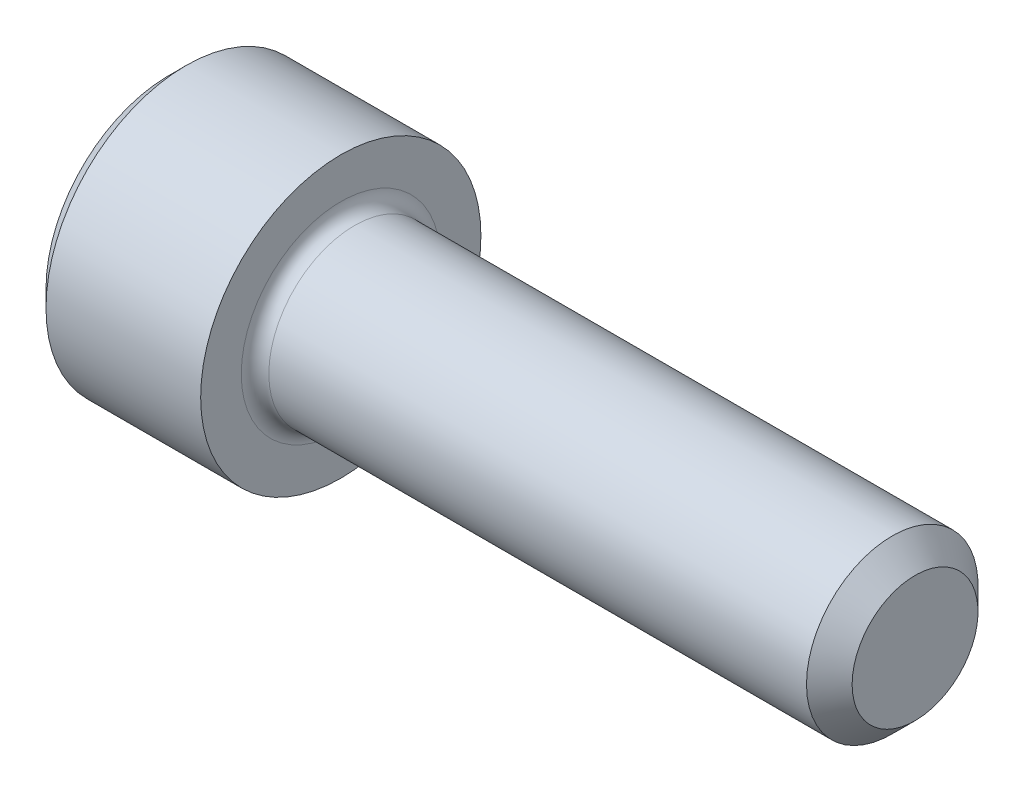
ISO-10303-21;
HEADER;
FILE_DESCRIPTION(('STEP AP214'),'2;1');
FILE_NAME('part.step','',(''),(''),'','','');
FILE_SCHEMA(('AUTOMOTIVE_DESIGN { 1 0 10303 214 1 1 1 1 }'));
ENDSEC;
DATA;
#1=APPLICATION_CONTEXT('core data for automotive mechanical design processes');
#2=APPLICATION_PROTOCOL_DEFINITION('international standard','automotive_design',2000,#1);
#3=PRODUCT_CONTEXT('',#1,'mechanical');
#4=PRODUCT('Part','Part','',(#3));
#5=PRODUCT_RELATED_PRODUCT_CATEGORY('part','',(#4));
#6=PRODUCT_DEFINITION_FORMATION('','',#4);
#7=PRODUCT_DEFINITION_CONTEXT('part definition',#1,'design');
#8=PRODUCT_DEFINITION('design','',#6,#7);
#9=PRODUCT_DEFINITION_SHAPE('','',#8);
#10=(LENGTH_UNIT() NAMED_UNIT(*) SI_UNIT(.MILLI.,.METRE.));
#11=(NAMED_UNIT(*) PLANE_ANGLE_UNIT() SI_UNIT($,.RADIAN.));
#12=(NAMED_UNIT(*) SI_UNIT($,.STERADIAN.) SOLID_ANGLE_UNIT());
#13=UNCERTAINTY_MEASURE_WITH_UNIT(LENGTH_MEASURE(1.E-05),#10,'distance_accuracy_value','');
#14=(GEOMETRIC_REPRESENTATION_CONTEXT(3) GLOBAL_UNCERTAINTY_ASSIGNED_CONTEXT((#13)) GLOBAL_UNIT_ASSIGNED_CONTEXT((#10,
#11,#12)) REPRESENTATION_CONTEXT('',''));
#15=CARTESIAN_POINT('',(0.,0.,0.));
#16=DIRECTION('',(0.,0.,1.));
#17=DIRECTION('',(1.,0.,0.));
#18=AXIS2_PLACEMENT_3D('',#15,#16,#17);
#19=CARTESIAN_POINT('',(0.,0.,0.));
#20=DIRECTION('',(-1.,0.,0.));
#21=DIRECTION('',(0.,0.,1.));
#22=AXIS2_PLACEMENT_3D('',#19,#20,#21);
#23=PLANE('',#22);
#24=DIRECTION('',(0.,-0.499999999999999,0.866025403784439));
#25=VECTOR('',#24,1.);
#26=CARTESIAN_POINT('',(0.,1.37848150271716,0.));
#27=LINE('',#26,#25);
#28=CARTESIAN_POINT('',(0.,1.37848150271716,0.));
#29=VERTEX_POINT('',#28);
#30=CARTESIAN_POINT('',(0.,0.689240751358582,1.1938));
#31=VERTEX_POINT('',#30);
#32=EDGE_CURVE('E117',#29,#31,#27,.T.);
#33=ORIENTED_EDGE('',*,*,#32,.T.);
#34=DIRECTION('',(0.,1.,0.));
#35=VECTOR('',#34,1.);
#36=CARTESIAN_POINT('',(0.,-0.689240751358569,1.1938));
#37=LINE('',#36,#35);
#38=CARTESIAN_POINT('',(0.,-0.689240751358569,1.1938));
#39=VERTEX_POINT('',#38);
#40=EDGE_CURVE('E106',#39,#31,#37,.T.);
#41=ORIENTED_EDGE('',*,*,#40,.F.);
#42=DIRECTION('',(0.,-0.500000000000001,-0.866025403784438));
#43=VECTOR('',#42,1.);
#44=CARTESIAN_POINT('',(0.,-0.689240751358569,1.1938));
#45=LINE('',#44,#43);
#46=CARTESIAN_POINT('',(0.,-1.37848150271715,0.));
#47=VERTEX_POINT('',#46);
#48=EDGE_CURVE('E116',#39,#47,#45,.T.);
#49=ORIENTED_EDGE('',*,*,#48,.T.);
#50=DIRECTION('',(0.,0.499999999999999,-0.866025403784439));
#51=VECTOR('',#50,1.);
#52=CARTESIAN_POINT('',(0.,-1.37848150271715,0.));
#53=LINE('',#52,#51);
#54=CARTESIAN_POINT('',(0.,-0.689240751358572,-1.1938));
#55=VERTEX_POINT('',#54);
#56=EDGE_CURVE('E131',#47,#55,#53,.T.);
#57=ORIENTED_EDGE('',*,*,#56,.T.);
#58=DIRECTION('',(0.,-1.,0.));
#59=VECTOR('',#58,1.);
#60=CARTESIAN_POINT('',(0.,0.689240751358578,-1.1938));
#61=LINE('',#60,#59);
#62=CARTESIAN_POINT('',(0.,0.689240751358578,-1.1938));
#63=VERTEX_POINT('',#62);
#64=EDGE_CURVE('E134',#63,#55,#61,.T.);
#65=ORIENTED_EDGE('',*,*,#64,.F.);
#66=DIRECTION('',(0.,-0.500000000000001,-0.866025403784438));
#67=VECTOR('',#66,1.);
#68=CARTESIAN_POINT('',(0.,1.37848150271716,0.));
#69=LINE('',#68,#67);
#70=EDGE_CURVE('E126',#29,#63,#69,.T.);
#71=ORIENTED_EDGE('',*,*,#70,.F.);
#72=EDGE_LOOP('',(#33,#41,#49,#57,#65,#71));
#73=FACE_BOUND('',#72,.T.);
#74=CARTESIAN_POINT('',(0.,0.,0.));
#75=DIRECTION('',(-1.,0.,0.));
#76=DIRECTION('',(0.,0.,1.));
#77=AXIS2_PLACEMENT_3D('',#74,#75,#76);
#78=CIRCLE('',#77,2.04469999999999);
#79=CARTESIAN_POINT('',(0.,0.,2.04469999999999));
#80=VERTEX_POINT('',#79);
#81=EDGE_CURVE('E186',#80,#80,#78,.T.);
#82=ORIENTED_EDGE('',*,*,#81,.T.);
#83=EDGE_LOOP('',(#82));
#84=FACE_BOUND('',#83,.T.);
#85=ADVANCED_FACE('F34',(#73,#84),#23,.T.);
#86=CARTESIAN_POINT('',(0.,0.,0.));
#87=DIRECTION('',(1.,0.,0.));
#88=DIRECTION('',(0.,0.,-1.));
#89=AXIS2_PLACEMENT_3D('',#86,#87,#88);
#90=CONICAL_SURFACE('',#89,2.04469999999999,0.785398163397459);
#91=CARTESIAN_POINT('',(0.279400000000006,0.,0.));
#92=DIRECTION('',(-1.,0.,0.));
#93=DIRECTION('',(0.,0.,1.));
#94=AXIS2_PLACEMENT_3D('',#91,#92,#93);
#95=CIRCLE('',#94,2.3241);
#96=CARTESIAN_POINT('',(0.279400000000006,0.,2.3241));
#97=VERTEX_POINT('',#96);
#98=EDGE_CURVE('E183',#97,#97,#95,.T.);
#99=ORIENTED_EDGE('',*,*,#98,.T.);
#100=EDGE_LOOP('',(#99));
#101=FACE_BOUND('',#100,.T.);
#102=ORIENTED_EDGE('',*,*,#81,.F.);
#103=EDGE_LOOP('',(#102));
#104=FACE_BOUND('',#103,.T.);
#105=ADVANCED_FACE('F210',(#101,#104),#90,.T.);
#106=CARTESIAN_POINT('',(-31.75,0.,0.));
#107=DIRECTION('',(-1.,0.,0.));
#108=DIRECTION('',(0.,0.,1.));
#109=AXIS2_PLACEMENT_3D('',#106,#107,#108);
#110=CYLINDRICAL_SURFACE('',#109,2.3241);
#111=CARTESIAN_POINT('',(2.84480000000001,0.,0.));
#112=DIRECTION('',(-1.,0.,0.));
#113=DIRECTION('',(0.,0.,1.));
#114=AXIS2_PLACEMENT_3D('',#111,#112,#113);
#115=CIRCLE('',#114,2.3241);
#116=CARTESIAN_POINT('',(2.84480000000001,0.,2.3241));
#117=VERTEX_POINT('',#116);
#118=EDGE_CURVE('E180',#117,#117,#115,.T.);
#119=ORIENTED_EDGE('',*,*,#118,.T.);
#120=EDGE_LOOP('',(#119));
#121=FACE_BOUND('',#120,.T.);
#122=ORIENTED_EDGE('',*,*,#98,.F.);
#123=EDGE_LOOP('',(#122));
#124=FACE_BOUND('',#123,.T.);
#125=ADVANCED_FACE('F214',(#121,#124),#110,.T.);
#126=CARTESIAN_POINT('',(2.84480000000001,2.3241,0.));
#127=DIRECTION('',(1.,0.,0.));
#128=DIRECTION('',(0.,0.,-1.));
#129=AXIS2_PLACEMENT_3D('',#126,#127,#128);
#130=PLANE('',#129);
#131=CARTESIAN_POINT('',(2.84480000000001,0.,0.));
#132=DIRECTION('',(1.,0.,0.));
#133=DIRECTION('',(0.,0.,-1.));
#134=AXIS2_PLACEMENT_3D('',#131,#132,#133);
#135=CIRCLE('',#134,1.651);
#136=CARTESIAN_POINT('',(2.84480000000001,0.,-1.651));
#137=VERTEX_POINT('',#136);
#138=EDGE_CURVE('E41',#137,#137,#135,.F.);
#139=ORIENTED_EDGE('',*,*,#138,.T.);
#140=EDGE_LOOP('',(#139));
#141=FACE_BOUND('',#140,.T.);
#142=ORIENTED_EDGE('',*,*,#118,.F.);
#143=EDGE_LOOP('',(#142));
#144=FACE_BOUND('',#143,.T.);
#145=ADVANCED_FACE('F191',(#141,#144),#130,.T.);
#146=CARTESIAN_POINT('',(-31.75,0.,0.));
#147=DIRECTION('',(-1.,0.,0.));
#148=DIRECTION('',(0.,0.,1.));
#149=AXIS2_PLACEMENT_3D('',#146,#147,#148);
#150=CYLINDRICAL_SURFACE('',#149,1.4224);
#151=CARTESIAN_POINT('',(3.0734,0.,0.));
#152=DIRECTION('',(1.,0.,0.));
#153=DIRECTION('',(0.,0.,-1.));
#154=AXIS2_PLACEMENT_3D('',#151,#152,#153);
#155=CIRCLE('',#154,1.4224);
#156=CARTESIAN_POINT('',(3.0734,0.,-1.4224));
#157=VERTEX_POINT('',#156);
#158=EDGE_CURVE('E11',#157,#157,#155,.T.);
#159=ORIENTED_EDGE('',*,*,#158,.T.);
#160=EDGE_LOOP('',(#159));
#161=FACE_BOUND('',#160,.T.);
#162=CARTESIAN_POINT('',(11.99134,0.,0.));
#163=DIRECTION('',(-1.,0.,0.));
#164=DIRECTION('',(0.,0.,1.));
#165=AXIS2_PLACEMENT_3D('',#162,#163,#164);
#166=CIRCLE('',#165,1.4224);
#167=CARTESIAN_POINT('',(11.99134,0.,1.4224));
#168=VERTEX_POINT('',#167);
#169=EDGE_CURVE('E177',#168,#168,#166,.T.);
#170=ORIENTED_EDGE('',*,*,#169,.T.);
#171=EDGE_LOOP('',(#170));
#172=FACE_BOUND('',#171,.T.);
#173=ADVANCED_FACE('F225',(#161,#172),#150,.T.);
#174=CARTESIAN_POINT('',(12.3698,0.,0.));
#175=DIRECTION('',(-1.,0.,0.));
#176=DIRECTION('',(0.,0.,1.));
#177=AXIS2_PLACEMENT_3D('',#174,#175,#176);
#178=CONICAL_SURFACE('',#177,1.04394,0.785398163397447);
#179=ORIENTED_EDGE('',*,*,#169,.F.);
#180=EDGE_LOOP('',(#179));
#181=FACE_BOUND('',#180,.T.);
#182=CARTESIAN_POINT('',(12.3698,0.,0.));
#183=DIRECTION('',(-1.,0.,0.));
#184=DIRECTION('',(0.,0.,1.));
#185=AXIS2_PLACEMENT_3D('',#182,#183,#184);
#186=CIRCLE('',#185,1.04394);
#187=CARTESIAN_POINT('',(12.3698,0.,1.04394));
#188=VERTEX_POINT('',#187);
#189=EDGE_CURVE('E173',#188,#188,#186,.T.);
#190=ORIENTED_EDGE('',*,*,#189,.T.);
#191=EDGE_LOOP('',(#190));
#192=FACE_BOUND('',#191,.T.);
#193=ADVANCED_FACE('F204',(#181,#192),#178,.T.);
#194=CARTESIAN_POINT('',(12.3698,1.04394,0.));
#195=DIRECTION('',(1.,0.,0.));
#196=DIRECTION('',(0.,0.,-1.));
#197=AXIS2_PLACEMENT_3D('',#194,#195,#196);
#198=PLANE('',#197);
#199=ORIENTED_EDGE('',*,*,#189,.F.);
#200=EDGE_LOOP('',(#199));
#201=FACE_BOUND('',#200,.T.);
#202=ADVANCED_FACE('F196',(#201),#198,.T.);
#203=CARTESIAN_POINT('',(3.0734,0.,0.));
#204=DIRECTION('',(1.,0.,0.));
#205=DIRECTION('',(0.,0.,-1.));
#206=AXIS2_PLACEMENT_3D('',#203,#204,#205);
#207=TOROIDAL_SURFACE('',#206,1.651,0.2286);
#208=ORIENTED_EDGE('',*,*,#158,.F.);
#209=EDGE_LOOP('',(#208));
#210=FACE_BOUND('',#209,.T.);
#211=ORIENTED_EDGE('',*,*,#138,.F.);
#212=EDGE_LOOP('',(#211));
#213=FACE_BOUND('',#212,.T.);
#214=ADVANCED_FACE('F194',(#210,#213),#207,.F.);
#215=CARTESIAN_POINT('',(1.2954,1.37848150271716,0.));
#216=DIRECTION('',(0.,-0.866025403784439,-0.499999999999999));
#217=DIRECTION('',(0.,0.499999999999999,-0.866025403784439));
#218=AXIS2_PLACEMENT_3D('',#215,#216,#217);
#219=PLANE('',#218);
#220=ORIENTED_EDGE('',*,*,#32,.F.);
#221=DIRECTION('',(-1.,0.,0.));
#222=VECTOR('',#221,1.);
#223=CARTESIAN_POINT('',(1.2954,1.37848150271716,0.));
#224=LINE('',#223,#222);
#225=CARTESIAN_POINT('',(1.2954,1.37848150271716,0.));
#226=VERTEX_POINT('',#225);
#227=EDGE_CURVE('E158',#226,#29,#224,.T.);
#228=ORIENTED_EDGE('',*,*,#227,.F.);
#229=DIRECTION('',(0.,-0.499999999999999,0.866025403784439));
#230=VECTOR('',#229,1.);
#231=CARTESIAN_POINT('',(1.2954,1.37848150271716,0.));
#232=LINE('',#231,#230);
#233=CARTESIAN_POINT('',(1.29540000000001,1.03386112703786,0.596899999999998));
#234=VERTEX_POINT('',#233);
#235=EDGE_CURVE('E48',#226,#234,#232,.T.);
#236=ORIENTED_EDGE('',*,*,#235,.T.);
#237=CARTESIAN_POINT('',(1.2954,0.689240751358582,1.1938));
#238=VERTEX_POINT('',#237);
#239=EDGE_CURVE('E121',#234,#238,#232,.T.);
#240=ORIENTED_EDGE('',*,*,#239,.T.);
#241=DIRECTION('',(-1.,0.,0.));
#242=VECTOR('',#241,1.);
#243=CARTESIAN_POINT('',(1.2954,0.689240751358582,1.1938));
#244=LINE('',#243,#242);
#245=EDGE_CURVE('E110',#238,#31,#244,.T.);
#246=ORIENTED_EDGE('',*,*,#245,.T.);
#247=EDGE_LOOP('',(#220,#228,#236,#240,#246));
#248=FACE_BOUND('',#247,.T.);
#249=ADVANCED_FACE('F119',(#248),#219,.T.);
#250=CARTESIAN_POINT('',(1.2954,-0.689240751358569,1.1938));
#251=DIRECTION('',(0.,0.,1.));
#252=DIRECTION('',(0.,-1.,0.));
#253=AXIS2_PLACEMENT_3D('',#250,#251,#252);
#254=PLANE('',#253);
#255=ORIENTED_EDGE('',*,*,#40,.T.);
#256=ORIENTED_EDGE('',*,*,#245,.F.);
#257=DIRECTION('',(0.,1.,0.));
#258=VECTOR('',#257,1.);
#259=CARTESIAN_POINT('',(1.2954,-0.689240751358569,1.1938));
#260=LINE('',#259,#258);
#261=CARTESIAN_POINT('',(1.2954,0.,1.1938));
#262=VERTEX_POINT('',#261);
#263=EDGE_CURVE('E138',#262,#238,#260,.T.);
#264=ORIENTED_EDGE('',*,*,#263,.F.);
#265=CARTESIAN_POINT('',(1.2954,-0.689240751358569,1.1938));
#266=VERTEX_POINT('',#265);
#267=EDGE_CURVE('E139',#266,#262,#260,.T.);
#268=ORIENTED_EDGE('',*,*,#267,.F.);
#269=DIRECTION('',(-1.,0.,0.));
#270=VECTOR('',#269,1.);
#271=CARTESIAN_POINT('',(1.2954,-0.689240751358569,1.1938));
#272=LINE('',#271,#270);
#273=EDGE_CURVE('E112',#266,#39,#272,.T.);
#274=ORIENTED_EDGE('',*,*,#273,.T.);
#275=EDGE_LOOP('',(#255,#256,#264,#268,#274));
#276=FACE_BOUND('',#275,.T.);
#277=ADVANCED_FACE('F108',(#276),#254,.F.);
#278=CARTESIAN_POINT('',(1.2954,-0.689240751358569,1.1938));
#279=DIRECTION('',(0.,0.866025403784438,-0.500000000000001));
#280=DIRECTION('',(0.,0.500000000000001,0.866025403784438));
#281=AXIS2_PLACEMENT_3D('',#278,#279,#280);
#282=PLANE('',#281);
#283=ORIENTED_EDGE('',*,*,#48,.F.);
#284=ORIENTED_EDGE('',*,*,#273,.F.);
#285=DIRECTION('',(0.,-0.500000000000001,-0.866025403784438));
#286=VECTOR('',#285,1.);
#287=CARTESIAN_POINT('',(1.2954,-0.689240751358569,1.1938));
#288=LINE('',#287,#286);
#289=CARTESIAN_POINT('',(1.2954,-1.03386112703786,0.596899999999999));
#290=VERTEX_POINT('',#289);
#291=EDGE_CURVE('E143',#266,#290,#288,.T.);
#292=ORIENTED_EDGE('',*,*,#291,.T.);
#293=CARTESIAN_POINT('',(1.2954,-1.37848150271715,0.));
#294=VERTEX_POINT('',#293);
#295=EDGE_CURVE('E142',#290,#294,#288,.T.);
#296=ORIENTED_EDGE('',*,*,#295,.T.);
#297=DIRECTION('',(-1.,0.,0.));
#298=VECTOR('',#297,1.);
#299=CARTESIAN_POINT('',(1.2954,-1.37848150271715,0.));
#300=LINE('',#299,#298);
#301=EDGE_CURVE('E166',#294,#47,#300,.T.);
#302=ORIENTED_EDGE('',*,*,#301,.T.);
#303=EDGE_LOOP('',(#283,#284,#292,#296,#302));
#304=FACE_BOUND('',#303,.T.);
#305=ADVANCED_FACE('F281',(#304),#282,.T.);
#306=CARTESIAN_POINT('',(1.2954,-1.37848150271715,0.));
#307=DIRECTION('',(0.,0.866025403784439,0.499999999999999));
#308=DIRECTION('',(0.,-0.499999999999999,0.866025403784439));
#309=AXIS2_PLACEMENT_3D('',#306,#307,#308);
#310=PLANE('',#309);
#311=ORIENTED_EDGE('',*,*,#56,.F.);
#312=ORIENTED_EDGE('',*,*,#301,.F.);
#313=DIRECTION('',(0.,0.499999999999999,-0.866025403784439));
#314=VECTOR('',#313,1.);
#315=CARTESIAN_POINT('',(1.2954,-1.37848150271715,0.));
#316=LINE('',#315,#314);
#317=CARTESIAN_POINT('',(1.2954,-1.03386112703786,-0.596899999999997));
#318=VERTEX_POINT('',#317);
#319=EDGE_CURVE('E147',#294,#318,#316,.T.);
#320=ORIENTED_EDGE('',*,*,#319,.T.);
#321=CARTESIAN_POINT('',(1.2954,-0.689240751358572,-1.1938));
#322=VERTEX_POINT('',#321);
#323=EDGE_CURVE('E146',#318,#322,#316,.T.);
#324=ORIENTED_EDGE('',*,*,#323,.T.);
#325=DIRECTION('',(-1.,0.,0.));
#326=VECTOR('',#325,1.);
#327=CARTESIAN_POINT('',(1.2954,-0.689240751358572,-1.1938));
#328=LINE('',#327,#326);
#329=EDGE_CURVE('E163',#322,#55,#328,.T.);
#330=ORIENTED_EDGE('',*,*,#329,.T.);
#331=EDGE_LOOP('',(#311,#312,#320,#324,#330));
#332=FACE_BOUND('',#331,.T.);
#333=ADVANCED_FACE('F290',(#332),#310,.T.);
#334=CARTESIAN_POINT('',(1.2954,0.689240751358578,-1.1938));
#335=DIRECTION('',(0.,0.,-1.));
#336=DIRECTION('',(0.,1.,0.));
#337=AXIS2_PLACEMENT_3D('',#334,#335,#336);
#338=PLANE('',#337);
#339=ORIENTED_EDGE('',*,*,#64,.T.);
#340=ORIENTED_EDGE('',*,*,#329,.F.);
#341=DIRECTION('',(0.,-1.,0.));
#342=VECTOR('',#341,1.);
#343=CARTESIAN_POINT('',(1.2954,0.689240751358578,-1.1938));
#344=LINE('',#343,#342);
#345=CARTESIAN_POINT('',(1.2954,0.,-1.1938));
#346=VERTEX_POINT('',#345);
#347=EDGE_CURVE('E150',#346,#322,#344,.T.);
#348=ORIENTED_EDGE('',*,*,#347,.F.);
#349=CARTESIAN_POINT('',(1.2954,0.689240751358578,-1.1938));
#350=VERTEX_POINT('',#349);
#351=EDGE_CURVE('E151',#350,#346,#344,.T.);
#352=ORIENTED_EDGE('',*,*,#351,.F.);
#353=DIRECTION('',(-1.,0.,0.));
#354=VECTOR('',#353,1.);
#355=CARTESIAN_POINT('',(1.2954,0.689240751358578,-1.1938));
#356=LINE('',#355,#354);
#357=EDGE_CURVE('E160',#350,#63,#356,.T.);
#358=ORIENTED_EDGE('',*,*,#357,.T.);
#359=EDGE_LOOP('',(#339,#340,#348,#352,#358));
#360=FACE_BOUND('',#359,.T.);
#361=ADVANCED_FACE('F300',(#360),#338,.F.);
#362=CARTESIAN_POINT('',(1.2954,1.37848150271716,0.));
#363=DIRECTION('',(0.,0.866025403784438,-0.500000000000001));
#364=DIRECTION('',(0.,0.500000000000001,0.866025403784438));
#365=AXIS2_PLACEMENT_3D('',#362,#363,#364);
#366=PLANE('',#365);
#367=ORIENTED_EDGE('',*,*,#70,.T.);
#368=ORIENTED_EDGE('',*,*,#357,.F.);
#369=DIRECTION('',(0.,-0.500000000000001,-0.866025403784438));
#370=VECTOR('',#369,1.);
#371=CARTESIAN_POINT('',(1.2954,1.37848150271716,0.));
#372=LINE('',#371,#370);
#373=CARTESIAN_POINT('',(1.2954,1.03386112703787,-0.596900000000004));
#374=VERTEX_POINT('',#373);
#375=EDGE_CURVE('E154',#374,#350,#372,.T.);
#376=ORIENTED_EDGE('',*,*,#375,.F.);
#377=EDGE_CURVE('E155',#226,#374,#372,.T.);
#378=ORIENTED_EDGE('',*,*,#377,.F.);
#379=ORIENTED_EDGE('',*,*,#227,.T.);
#380=EDGE_LOOP('',(#367,#368,#376,#378,#379));
#381=FACE_BOUND('',#380,.T.);
#382=ADVANCED_FACE('F310',(#381),#366,.F.);
#383=CARTESIAN_POINT('',(1.2954,0.689240751358581,1.1938));
#384=DIRECTION('',(-1.,0.,0.));
#385=DIRECTION('',(0.,0.,1.));
#386=AXIS2_PLACEMENT_3D('',#383,#384,#385);
#387=PLANE('',#386);
#388=CARTESIAN_POINT('',(1.29540000000001,0.,0.));
#389=DIRECTION('',(-1.,0.,0.));
#390=DIRECTION('',(0.,0.,1.));
#391=AXIS2_PLACEMENT_3D('',#388,#389,#390);
#392=CIRCLE('',#391,1.1938);
#393=EDGE_CURVE('E122',#290,#262,#392,.T.);
#394=ORIENTED_EDGE('',*,*,#393,.F.);
#395=ORIENTED_EDGE('',*,*,#291,.F.);
#396=ORIENTED_EDGE('',*,*,#267,.T.);
#397=EDGE_LOOP('',(#394,#395,#396));
#398=FACE_BOUND('',#397,.T.);
#399=ADVANCED_FACE('F320',(#398),#387,.T.);
#400=EDGE_CURVE('E396',#318,#290,#392,.T.);
#401=ORIENTED_EDGE('',*,*,#400,.F.);
#402=ORIENTED_EDGE('',*,*,#319,.F.);
#403=ORIENTED_EDGE('',*,*,#295,.F.);
#404=EDGE_LOOP('',(#401,#402,#403));
#405=FACE_BOUND('',#404,.T.);
#406=ADVANCED_FACE('F330',(#405),#387,.T.);
#407=EDGE_CURVE('E397',#346,#318,#392,.T.);
#408=ORIENTED_EDGE('',*,*,#407,.F.);
#409=ORIENTED_EDGE('',*,*,#347,.T.);
#410=ORIENTED_EDGE('',*,*,#323,.F.);
#411=EDGE_LOOP('',(#408,#409,#410));
#412=FACE_BOUND('',#411,.T.);
#413=ADVANCED_FACE('F341',(#412),#387,.T.);
#414=EDGE_CURVE('E400',#374,#346,#392,.T.);
#415=ORIENTED_EDGE('',*,*,#414,.F.);
#416=ORIENTED_EDGE('',*,*,#375,.T.);
#417=ORIENTED_EDGE('',*,*,#351,.T.);
#418=EDGE_LOOP('',(#415,#416,#417));
#419=FACE_BOUND('',#418,.T.);
#420=ADVANCED_FACE('F350',(#419),#387,.T.);
#421=EDGE_CURVE('E174',#234,#374,#392,.T.);
#422=ORIENTED_EDGE('',*,*,#421,.F.);
#423=ORIENTED_EDGE('',*,*,#235,.F.);
#424=ORIENTED_EDGE('',*,*,#377,.T.);
#425=EDGE_LOOP('',(#422,#423,#424));
#426=FACE_BOUND('',#425,.T.);
#427=ADVANCED_FACE('F359',(#426),#387,.T.);
#428=EDGE_CURVE('E170',#262,#234,#392,.T.);
#429=ORIENTED_EDGE('',*,*,#428,.F.);
#430=ORIENTED_EDGE('',*,*,#263,.T.);
#431=ORIENTED_EDGE('',*,*,#239,.F.);
#432=EDGE_LOOP('',(#429,#430,#431));
#433=FACE_BOUND('',#432,.T.);
#434=ADVANCED_FACE('F333',(#433),#387,.T.);
#435=CARTESIAN_POINT('',(1.29540000000001,0.,0.));
#436=DIRECTION('',(-1.,0.,0.));
#437=DIRECTION('',(0.,0.,1.));
#438=AXIS2_PLACEMENT_3D('',#435,#436,#437);
#439=CONICAL_SURFACE('',#438,1.1938,1.04719755119659);
#440=CARTESIAN_POINT('',(1.98464075135859,0.,0.));
#441=VERTEX_POINT('',#440);
#442=VERTEX_LOOP('',#441);
#443=FACE_BOUND('',#442,.T.);
#444=ORIENTED_EDGE('',*,*,#428,.T.);
#445=ORIENTED_EDGE('',*,*,#421,.T.);
#446=ORIENTED_EDGE('',*,*,#414,.T.);
#447=ORIENTED_EDGE('',*,*,#407,.T.);
#448=ORIENTED_EDGE('',*,*,#400,.T.);
#449=ORIENTED_EDGE('',*,*,#393,.T.);
#450=EDGE_LOOP('',(#444,#445,#446,#447,#448,#449));
#451=FACE_BOUND('',#450,.T.);
#452=ADVANCED_FACE('F376',(#443,#451),#439,.F.);
#453=CLOSED_SHELL('',(#85,#105,#125,#145,#173,#193,#202,#214,#249,#277,#305,#333,#361,#382,#399,
#406,#413,#420,#427,#434,#452));
#454=MANIFOLD_SOLID_BREP('B2',#453);
#455=ADVANCED_BREP_SHAPE_REPRESENTATION('',(#18,#454),#14);
#456=SHAPE_DEFINITION_REPRESENTATION(#9,#455);
ENDSEC;
END-ISO-10303-21;
